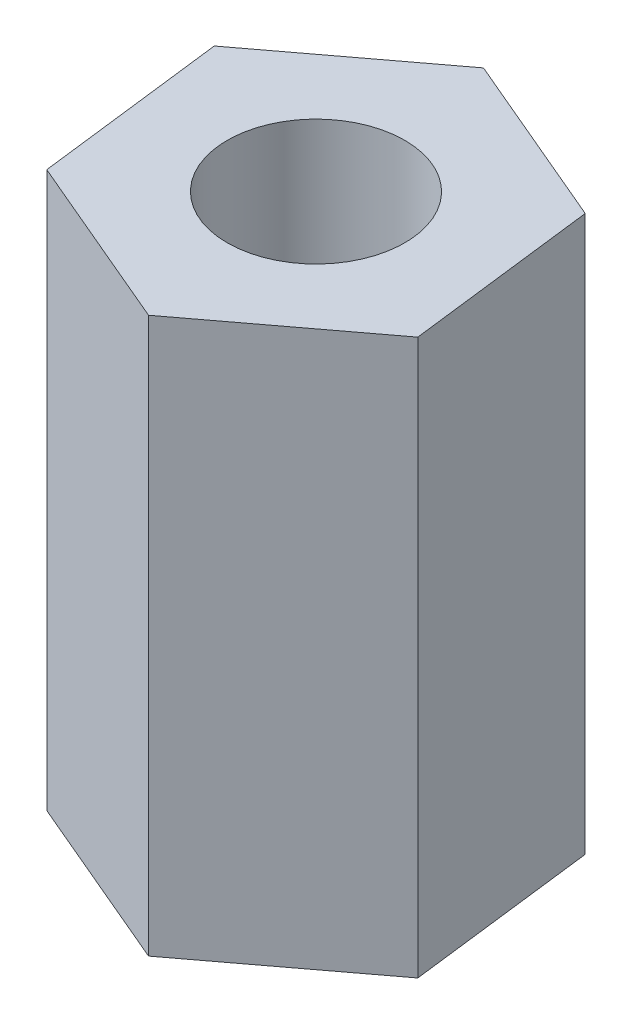
ISO-10303-21;
HEADER;
FILE_DESCRIPTION(('STEP AP214'),'2;1');
FILE_NAME('part.step','',(''),(''),'','','');
FILE_SCHEMA(('AUTOMOTIVE_DESIGN { 1 0 10303 214 1 1 1 1 }'));
ENDSEC;
DATA;
#1=APPLICATION_CONTEXT('core data for automotive mechanical design processes');
#2=APPLICATION_PROTOCOL_DEFINITION('international standard','automotive_design',2000,#1);
#3=PRODUCT_CONTEXT('',#1,'mechanical');
#4=PRODUCT('Part','Part','',(#3));
#5=PRODUCT_RELATED_PRODUCT_CATEGORY('part','',(#4));
#6=PRODUCT_DEFINITION_FORMATION('','',#4);
#7=PRODUCT_DEFINITION_CONTEXT('part definition',#1,'design');
#8=PRODUCT_DEFINITION('design','',#6,#7);
#9=PRODUCT_DEFINITION_SHAPE('','',#8);
#10=(LENGTH_UNIT() NAMED_UNIT(*) SI_UNIT(.MILLI.,.METRE.));
#11=(NAMED_UNIT(*) PLANE_ANGLE_UNIT() SI_UNIT($,.RADIAN.));
#12=(NAMED_UNIT(*) SI_UNIT($,.STERADIAN.) SOLID_ANGLE_UNIT());
#13=UNCERTAINTY_MEASURE_WITH_UNIT(LENGTH_MEASURE(1.E-05),#10,'distance_accuracy_value','');
#14=(GEOMETRIC_REPRESENTATION_CONTEXT(3) GLOBAL_UNCERTAINTY_ASSIGNED_CONTEXT((#13)) GLOBAL_UNIT_ASSIGNED_CONTEXT((#10,
#11,#12)) REPRESENTATION_CONTEXT('',''));
#15=CARTESIAN_POINT('',(0.,0.,0.));
#16=DIRECTION('',(0.,0.,1.));
#17=DIRECTION('',(1.,0.,0.));
#18=AXIS2_PLACEMENT_3D('',#15,#16,#17);
#19=CARTESIAN_POINT('',(0.,10.,0.));
#20=DIRECTION('',(0.,1.,0.));
#21=DIRECTION('',(0.,0.,1.));
#22=AXIS2_PLACEMENT_3D('',#19,#20,#21);
#23=PLANE('',#22);
#24=DIRECTION('',(-0.121573231281397,0.,-0.992582464803706));
#25=VECTOR('',#24,1.);
#26=CARTESIAN_POINT('',(3.18831840783081,10.,1.35448356589777));
#27=LINE('',#26,#25);
#28=CARTESIAN_POINT('',(3.18831840783081,10.,1.35448356589777));
#29=VERTEX_POINT('',#28);
#30=CARTESIAN_POINT('',(2.76717638099141,10.,-2.08392295358615));
#31=VERTEX_POINT('',#30);
#32=EDGE_CURVE('E131',#29,#31,#27,.T.);
#33=ORIENTED_EDGE('',*,*,#32,.T.);
#34=DIRECTION('',(-0.920388245511681,0.,-0.391005725692002));
#35=VECTOR('',#34,1.);
#36=CARTESIAN_POINT('',(2.76717638099141,10.,-2.08392295358615));
#37=LINE('',#36,#35);
#38=CARTESIAN_POINT('',(-0.421142026839402,10.,-3.43840651948392));
#39=VERTEX_POINT('',#38);
#40=EDGE_CURVE('E89',#31,#39,#37,.T.);
#41=ORIENTED_EDGE('',*,*,#40,.T.);
#42=DIRECTION('',(-0.798815014230284,0.,0.601576739111704));
#43=VECTOR('',#42,1.);
#44=CARTESIAN_POINT('',(-0.421142026839402,10.,-3.43840651948392));
#45=LINE('',#44,#43);
#46=CARTESIAN_POINT('',(-3.18831840783081,10.,-1.35448356589777));
#47=VERTEX_POINT('',#46);
#48=EDGE_CURVE('E102',#39,#47,#45,.T.);
#49=ORIENTED_EDGE('',*,*,#48,.T.);
#50=DIRECTION('',(0.121573231281397,0.,0.992582464803706));
#51=VECTOR('',#50,1.);
#52=CARTESIAN_POINT('',(-3.18831840783081,10.,-1.35448356589777));
#53=LINE('',#52,#51);
#54=CARTESIAN_POINT('',(-2.76717638099141,10.,2.08392295358615));
#55=VERTEX_POINT('',#54);
#56=EDGE_CURVE('E96',#47,#55,#53,.T.);
#57=ORIENTED_EDGE('',*,*,#56,.T.);
#58=DIRECTION('',(0.920388245511681,0.,0.391005725692002));
#59=VECTOR('',#58,1.);
#60=CARTESIAN_POINT('',(-2.76717638099141,10.,2.08392295358615));
#61=LINE('',#60,#59);
#62=CARTESIAN_POINT('',(0.421142026839401,10.,3.43840651948392));
#63=VERTEX_POINT('',#62);
#64=EDGE_CURVE('E100',#55,#63,#61,.T.);
#65=ORIENTED_EDGE('',*,*,#64,.T.);
#66=DIRECTION('',(0.798815014230284,0.,-0.601576739111704));
#67=VECTOR('',#66,1.);
#68=CARTESIAN_POINT('',(0.421142026839401,10.,3.43840651948392));
#69=LINE('',#68,#67);
#70=EDGE_CURVE('E52',#63,#29,#69,.T.);
#71=ORIENTED_EDGE('',*,*,#70,.T.);
#72=EDGE_LOOP('',(#33,#41,#49,#57,#65,#71));
#73=FACE_BOUND('',#72,.T.);
#74=CARTESIAN_POINT('',(0.,10.,0.));
#75=DIRECTION('',(0.,1.,0.));
#76=DIRECTION('',(0.,0.,1.));
#77=AXIS2_PLACEMENT_3D('',#74,#75,#76);
#78=CIRCLE('',#77,1.6);
#79=CARTESIAN_POINT('',(0.,10.,1.6));
#80=VERTEX_POINT('',#79);
#81=EDGE_CURVE('E124',#80,#80,#78,.T.);
#82=ORIENTED_EDGE('',*,*,#81,.F.);
#83=EDGE_LOOP('',(#82));
#84=FACE_BOUND('',#83,.T.);
#85=ADVANCED_FACE('F35',(#73,#84),#23,.T.);
#86=CARTESIAN_POINT('',(0.,0.,0.));
#87=DIRECTION('',(0.,1.,0.));
#88=DIRECTION('',(0.,0.,1.));
#89=AXIS2_PLACEMENT_3D('',#86,#87,#88);
#90=PLANE('',#89);
#91=DIRECTION('',(-0.121573231281397,0.,-0.992582464803706));
#92=VECTOR('',#91,1.);
#93=CARTESIAN_POINT('',(3.18831840783081,0.,1.35448356589777));
#94=LINE('',#93,#92);
#95=CARTESIAN_POINT('',(3.18831840783081,0.,1.35448356589777));
#96=VERTEX_POINT('',#95);
#97=CARTESIAN_POINT('',(2.76717638099141,0.,-2.08392295358615));
#98=VERTEX_POINT('',#97);
#99=EDGE_CURVE('E120',#96,#98,#94,.T.);
#100=ORIENTED_EDGE('',*,*,#99,.F.);
#101=DIRECTION('',(0.798815014230284,0.,-0.601576739111704));
#102=VECTOR('',#101,1.);
#103=CARTESIAN_POINT('',(0.421142026839401,0.,3.43840651948392));
#104=LINE('',#103,#102);
#105=CARTESIAN_POINT('',(0.421142026839401,0.,3.43840651948392));
#106=VERTEX_POINT('',#105);
#107=EDGE_CURVE('E81',#106,#96,#104,.T.);
#108=ORIENTED_EDGE('',*,*,#107,.F.);
#109=DIRECTION('',(0.920388245511681,0.,0.391005725692002));
#110=VECTOR('',#109,1.);
#111=CARTESIAN_POINT('',(-2.76717638099141,0.,2.08392295358615));
#112=LINE('',#111,#110);
#113=CARTESIAN_POINT('',(-2.76717638099141,0.,2.08392295358615));
#114=VERTEX_POINT('',#113);
#115=EDGE_CURVE('E75',#114,#106,#112,.T.);
#116=ORIENTED_EDGE('',*,*,#115,.F.);
#117=DIRECTION('',(0.121573231281397,0.,0.992582464803706));
#118=VECTOR('',#117,1.);
#119=CARTESIAN_POINT('',(-3.18831840783081,0.,-1.35448356589777));
#120=LINE('',#119,#118);
#121=CARTESIAN_POINT('',(-3.18831840783081,0.,-1.35448356589777));
#122=VERTEX_POINT('',#121);
#123=EDGE_CURVE('E110',#122,#114,#120,.T.);
#124=ORIENTED_EDGE('',*,*,#123,.F.);
#125=DIRECTION('',(-0.798815014230284,0.,0.601576739111704));
#126=VECTOR('',#125,1.);
#127=CARTESIAN_POINT('',(-0.421142026839402,0.,-3.43840651948392));
#128=LINE('',#127,#126);
#129=CARTESIAN_POINT('',(-0.421142026839402,0.,-3.43840651948392));
#130=VERTEX_POINT('',#129);
#131=EDGE_CURVE('E126',#130,#122,#128,.T.);
#132=ORIENTED_EDGE('',*,*,#131,.F.);
#133=DIRECTION('',(-0.920388245511681,0.,-0.391005725692002));
#134=VECTOR('',#133,1.);
#135=CARTESIAN_POINT('',(2.76717638099141,0.,-2.08392295358615));
#136=LINE('',#135,#134);
#137=EDGE_CURVE('E123',#98,#130,#136,.T.);
#138=ORIENTED_EDGE('',*,*,#137,.F.);
#139=EDGE_LOOP('',(#100,#108,#116,#124,#132,#138));
#140=FACE_BOUND('',#139,.T.);
#141=CARTESIAN_POINT('',(0.,0.,0.));
#142=DIRECTION('',(0.,1.,0.));
#143=DIRECTION('',(0.,0.,1.));
#144=AXIS2_PLACEMENT_3D('',#141,#142,#143);
#145=CIRCLE('',#144,1.6);
#146=CARTESIAN_POINT('',(0.,0.,1.6));
#147=VERTEX_POINT('',#146);
#148=EDGE_CURVE('E224',#147,#147,#145,.T.);
#149=ORIENTED_EDGE('',*,*,#148,.T.);
#150=EDGE_LOOP('',(#149));
#151=FACE_BOUND('',#150,.T.);
#152=ADVANCED_FACE('F140',(#140,#151),#90,.F.);
#153=CARTESIAN_POINT('',(3.18831840783081,10.,1.35448356589777));
#154=DIRECTION('',(-0.992582464803706,0.,0.121573231281397));
#155=DIRECTION('',(0.121573231281397,0.,0.992582464803706));
#156=AXIS2_PLACEMENT_3D('',#153,#154,#155);
#157=PLANE('',#156);
#158=ORIENTED_EDGE('',*,*,#99,.T.);
#159=DIRECTION('',(0.,-1.,0.));
#160=VECTOR('',#159,1.);
#161=CARTESIAN_POINT('',(2.76717638099141,10.,-2.08392295358615));
#162=LINE('',#161,#160);
#163=EDGE_CURVE('E11',#31,#98,#162,.T.);
#164=ORIENTED_EDGE('',*,*,#163,.F.);
#165=ORIENTED_EDGE('',*,*,#32,.F.);
#166=DIRECTION('',(0.,-1.,0.));
#167=VECTOR('',#166,1.);
#168=CARTESIAN_POINT('',(3.18831840783081,10.,1.35448356589777));
#169=LINE('',#168,#167);
#170=EDGE_CURVE('E116',#29,#96,#169,.T.);
#171=ORIENTED_EDGE('',*,*,#170,.T.);
#172=EDGE_LOOP('',(#158,#164,#165,#171));
#173=FACE_BOUND('',#172,.T.);
#174=ADVANCED_FACE('F37',(#173),#157,.F.);
#175=CARTESIAN_POINT('',(2.76717638099141,10.,-2.08392295358615));
#176=DIRECTION('',(-0.391005725692002,0.,0.920388245511681));
#177=DIRECTION('',(0.920388245511681,0.,0.391005725692002));
#178=AXIS2_PLACEMENT_3D('',#175,#176,#177);
#179=PLANE('',#178);
#180=ORIENTED_EDGE('',*,*,#137,.T.);
#181=DIRECTION('',(0.,-1.,0.));
#182=VECTOR('',#181,1.);
#183=CARTESIAN_POINT('',(-0.421142026839402,10.,-3.43840651948392));
#184=LINE('',#183,#182);
#185=EDGE_CURVE('E44',#39,#130,#184,.T.);
#186=ORIENTED_EDGE('',*,*,#185,.F.);
#187=ORIENTED_EDGE('',*,*,#40,.F.);
#188=ORIENTED_EDGE('',*,*,#163,.T.);
#189=EDGE_LOOP('',(#180,#186,#187,#188));
#190=FACE_BOUND('',#189,.T.);
#191=ADVANCED_FACE('F165',(#190),#179,.F.);
#192=CARTESIAN_POINT('',(-0.421142026839402,10.,-3.43840651948392));
#193=DIRECTION('',(0.601576739111704,0.,0.798815014230284));
#194=DIRECTION('',(0.798815014230284,0.,-0.601576739111704));
#195=AXIS2_PLACEMENT_3D('',#192,#193,#194);
#196=PLANE('',#195);
#197=ORIENTED_EDGE('',*,*,#131,.T.);
#198=DIRECTION('',(0.,-1.,0.));
#199=VECTOR('',#198,1.);
#200=CARTESIAN_POINT('',(-3.18831840783081,10.,-1.35448356589777));
#201=LINE('',#200,#199);
#202=EDGE_CURVE('E111',#47,#122,#201,.T.);
#203=ORIENTED_EDGE('',*,*,#202,.F.);
#204=ORIENTED_EDGE('',*,*,#48,.F.);
#205=ORIENTED_EDGE('',*,*,#185,.T.);
#206=EDGE_LOOP('',(#197,#203,#204,#205));
#207=FACE_BOUND('',#206,.T.);
#208=ADVANCED_FACE('F137',(#207),#196,.F.);
#209=CARTESIAN_POINT('',(-3.18831840783081,10.,-1.35448356589777));
#210=DIRECTION('',(0.992582464803706,0.,-0.121573231281397));
#211=DIRECTION('',(-0.121573231281397,0.,-0.992582464803706));
#212=AXIS2_PLACEMENT_3D('',#209,#210,#211);
#213=PLANE('',#212);
#214=ORIENTED_EDGE('',*,*,#123,.T.);
#215=DIRECTION('',(0.,-1.,0.));
#216=VECTOR('',#215,1.);
#217=CARTESIAN_POINT('',(-2.76717638099141,10.,2.08392295358615));
#218=LINE('',#217,#216);
#219=EDGE_CURVE('E107',#55,#114,#218,.T.);
#220=ORIENTED_EDGE('',*,*,#219,.F.);
#221=ORIENTED_EDGE('',*,*,#56,.F.);
#222=ORIENTED_EDGE('',*,*,#202,.T.);
#223=EDGE_LOOP('',(#214,#220,#221,#222));
#224=FACE_BOUND('',#223,.T.);
#225=ADVANCED_FACE('F108',(#224),#213,.F.);
#226=CARTESIAN_POINT('',(-2.76717638099141,10.,2.08392295358615));
#227=DIRECTION('',(0.391005725692002,0.,-0.920388245511681));
#228=DIRECTION('',(-0.920388245511681,0.,-0.391005725692002));
#229=AXIS2_PLACEMENT_3D('',#226,#227,#228);
#230=PLANE('',#229);
#231=ORIENTED_EDGE('',*,*,#115,.T.);
#232=DIRECTION('',(0.,-1.,0.));
#233=VECTOR('',#232,1.);
#234=CARTESIAN_POINT('',(0.421142026839401,10.,3.43840651948392));
#235=LINE('',#234,#233);
#236=EDGE_CURVE('E112',#63,#106,#235,.T.);
#237=ORIENTED_EDGE('',*,*,#236,.F.);
#238=ORIENTED_EDGE('',*,*,#64,.F.);
#239=ORIENTED_EDGE('',*,*,#219,.T.);
#240=EDGE_LOOP('',(#231,#237,#238,#239));
#241=FACE_BOUND('',#240,.T.);
#242=ADVANCED_FACE('F114',(#241),#230,.F.);
#243=CARTESIAN_POINT('',(0.421142026839401,10.,3.43840651948392));
#244=DIRECTION('',(-0.601576739111704,0.,-0.798815014230284));
#245=DIRECTION('',(-0.798815014230284,0.,0.601576739111704));
#246=AXIS2_PLACEMENT_3D('',#243,#244,#245);
#247=PLANE('',#246);
#248=ORIENTED_EDGE('',*,*,#107,.T.);
#249=ORIENTED_EDGE('',*,*,#170,.F.);
#250=ORIENTED_EDGE('',*,*,#70,.F.);
#251=ORIENTED_EDGE('',*,*,#236,.T.);
#252=EDGE_LOOP('',(#248,#249,#250,#251));
#253=FACE_BOUND('',#252,.T.);
#254=ADVANCED_FACE('F145',(#253),#247,.F.);
#255=CARTESIAN_POINT('',(0.,10.,0.));
#256=DIRECTION('',(0.,-1.,0.));
#257=DIRECTION('',(0.,0.,-1.));
#258=AXIS2_PLACEMENT_3D('',#255,#256,#257);
#259=CYLINDRICAL_SURFACE('',#258,1.6);
#260=ORIENTED_EDGE('',*,*,#81,.T.);
#261=EDGE_LOOP('',(#260));
#262=FACE_BOUND('',#261,.T.);
#263=ORIENTED_EDGE('',*,*,#148,.F.);
#264=EDGE_LOOP('',(#263));
#265=FACE_BOUND('',#264,.T.);
#266=ADVANCED_FACE('F147',(#262,#265),#259,.F.);
#267=CLOSED_SHELL('',(#85,#152,#174,#191,#208,#225,#242,#254,#266));
#268=MANIFOLD_SOLID_BREP('B2',#267);
#269=ADVANCED_BREP_SHAPE_REPRESENTATION('',(#18,#268),#14);
#270=SHAPE_DEFINITION_REPRESENTATION(#9,#269);
ENDSEC;
END-ISO-10303-21;
